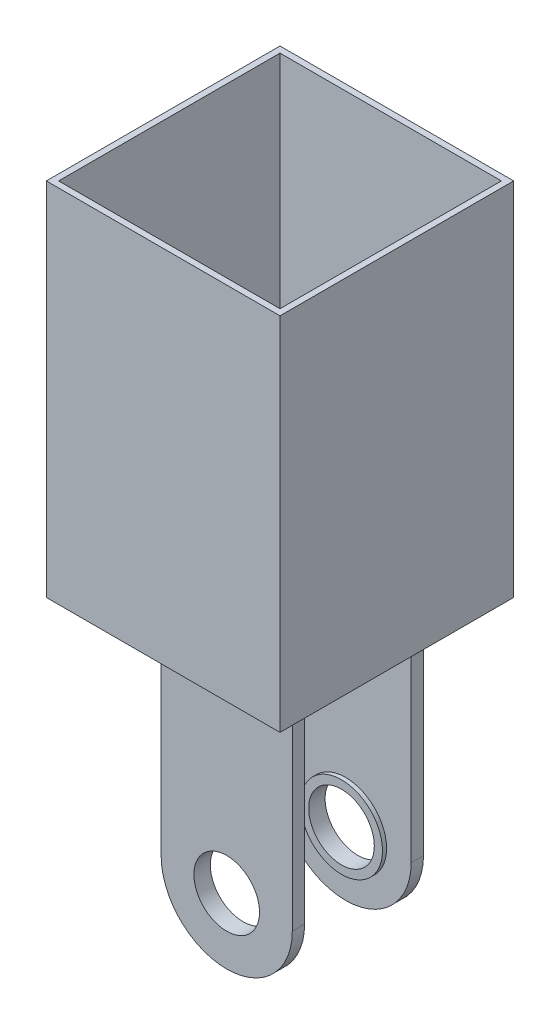
ISO-10303-21;
HEADER;
FILE_DESCRIPTION(('STEP AP214'),'2;1');
FILE_NAME('part.step','',(''),(''),'','','');
FILE_SCHEMA(('AUTOMOTIVE_DESIGN { 1 0 10303 214 1 1 1 1 }'));
ENDSEC;
DATA;
#1=APPLICATION_CONTEXT('core data for automotive mechanical design processes');
#2=APPLICATION_PROTOCOL_DEFINITION('international standard','automotive_design',2000,#1);
#3=PRODUCT_CONTEXT('',#1,'mechanical');
#4=PRODUCT('Part','Part','',(#3));
#5=PRODUCT_RELATED_PRODUCT_CATEGORY('part','',(#4));
#6=PRODUCT_DEFINITION_FORMATION('','',#4);
#7=PRODUCT_DEFINITION_CONTEXT('part definition',#1,'design');
#8=PRODUCT_DEFINITION('design','',#6,#7);
#9=PRODUCT_DEFINITION_SHAPE('','',#8);
#10=(LENGTH_UNIT() NAMED_UNIT(*) SI_UNIT(.MILLI.,.METRE.));
#11=(NAMED_UNIT(*) PLANE_ANGLE_UNIT() SI_UNIT($,.RADIAN.));
#12=(NAMED_UNIT(*) SI_UNIT($,.STERADIAN.) SOLID_ANGLE_UNIT());
#13=UNCERTAINTY_MEASURE_WITH_UNIT(LENGTH_MEASURE(1.E-05),#10,'distance_accuracy_value','');
#14=(GEOMETRIC_REPRESENTATION_CONTEXT(3) GLOBAL_UNCERTAINTY_ASSIGNED_CONTEXT((#13)) GLOBAL_UNIT_ASSIGNED_CONTEXT((#10,
#11,#12)) REPRESENTATION_CONTEXT('',''));
#15=CARTESIAN_POINT('',(0.,0.,0.));
#16=DIRECTION('',(0.,0.,1.));
#17=DIRECTION('',(1.,0.,0.));
#18=AXIS2_PLACEMENT_3D('',#15,#16,#17);
#19=CARTESIAN_POINT('',(0.,0.,3.));
#20=DIRECTION('',(0.,0.,1.));
#21=DIRECTION('',(1.,0.,0.));
#22=AXIS2_PLACEMENT_3D('',#19,#20,#21);
#23=PLANE('',#22);
#24=DIRECTION('',(1.,0.,0.));
#25=VECTOR('',#24,1.);
#26=CARTESIAN_POINT('',(0.,56.,3.));
#27=LINE('',#26,#25);
#28=CARTESIAN_POINT('',(-16.,56.,3.));
#29=VERTEX_POINT('',#28);
#30=CARTESIAN_POINT('',(16.,56.,3.));
#31=VERTEX_POINT('',#30);
#32=EDGE_CURVE('E261',#29,#31,#27,.T.);
#33=ORIENTED_EDGE('',*,*,#32,.F.);
#34=DIRECTION('',(0.,1.,0.));
#35=VECTOR('',#34,1.);
#36=CARTESIAN_POINT('',(-16.,0.,3.));
#37=LINE('',#36,#35);
#38=CARTESIAN_POINT('',(-16.,0.,3.));
#39=VERTEX_POINT('',#38);
#40=EDGE_CURVE('E282',#39,#29,#37,.T.);
#41=ORIENTED_EDGE('',*,*,#40,.F.);
#42=CARTESIAN_POINT('',(0.,0.,3.));
#43=DIRECTION('',(0.,0.,1.));
#44=DIRECTION('',(1.,0.,0.));
#45=AXIS2_PLACEMENT_3D('',#42,#43,#44);
#46=CIRCLE('',#45,16.);
#47=CARTESIAN_POINT('',(16.,0.,3.));
#48=VERTEX_POINT('',#47);
#49=EDGE_CURVE('E285',#39,#48,#46,.T.);
#50=ORIENTED_EDGE('',*,*,#49,.T.);
#51=DIRECTION('',(0.,1.,0.));
#52=VECTOR('',#51,1.);
#53=CARTESIAN_POINT('',(16.,0.,3.));
#54=LINE('',#53,#52);
#55=EDGE_CURVE('E289',#48,#31,#54,.T.);
#56=ORIENTED_EDGE('',*,*,#55,.T.);
#57=EDGE_LOOP('',(#33,#41,#50,#56));
#58=FACE_BOUND('',#57,.T.);
#59=CARTESIAN_POINT('',(0.,0.,3.));
#60=DIRECTION('',(0.,0.,1.));
#61=DIRECTION('',(1.,0.,0.));
#62=AXIS2_PLACEMENT_3D('',#59,#60,#61);
#63=CIRCLE('',#62,10.);
#64=CARTESIAN_POINT('',(10.,0.,3.));
#65=VERTEX_POINT('',#64);
#66=EDGE_CURVE('E275',#65,#65,#63,.T.);
#67=ORIENTED_EDGE('',*,*,#66,.F.);
#68=EDGE_LOOP('',(#67));
#69=FACE_BOUND('',#68,.T.);
#70=ADVANCED_FACE('F40',(#58,#69),#23,.T.);
#71=CARTESIAN_POINT('',(-16.,0.,3.));
#72=DIRECTION('',(-1.,0.,0.));
#73=DIRECTION('',(0.,0.,1.));
#74=AXIS2_PLACEMENT_3D('',#71,#72,#73);
#75=PLANE('',#74);
#76=DIRECTION('',(0.,1.,0.));
#77=VECTOR('',#76,1.);
#78=CARTESIAN_POINT('',(-16.,0.,0.));
#79=LINE('',#78,#77);
#80=CARTESIAN_POINT('',(-16.,0.,0.));
#81=VERTEX_POINT('',#80);
#82=CARTESIAN_POINT('',(-16.,56.,0.));
#83=VERTEX_POINT('',#82);
#84=EDGE_CURVE('E294',#81,#83,#79,.T.);
#85=ORIENTED_EDGE('',*,*,#84,.F.);
#86=DIRECTION('',(0.,0.,-1.));
#87=VECTOR('',#86,1.);
#88=CARTESIAN_POINT('',(-16.,0.,3.));
#89=LINE('',#88,#87);
#90=EDGE_CURVE('E48',#39,#81,#89,.T.);
#91=ORIENTED_EDGE('',*,*,#90,.F.);
#92=ORIENTED_EDGE('',*,*,#40,.T.);
#93=DIRECTION('',(0.,0.,-1.));
#94=VECTOR('',#93,1.);
#95=CARTESIAN_POINT('',(-16.,56.,3.));
#96=LINE('',#95,#94);
#97=EDGE_CURVE('E291',#29,#83,#96,.T.);
#98=ORIENTED_EDGE('',*,*,#97,.T.);
#99=EDGE_LOOP('',(#85,#91,#92,#98));
#100=FACE_BOUND('',#99,.T.);
#101=ADVANCED_FACE('F323',(#100),#75,.T.);
#102=CARTESIAN_POINT('',(0.,0.,3.));
#103=DIRECTION('',(0.,0.,-1.));
#104=DIRECTION('',(-1.,0.,0.));
#105=AXIS2_PLACEMENT_3D('',#102,#103,#104);
#106=CYLINDRICAL_SURFACE('',#105,16.);
#107=CARTESIAN_POINT('',(0.,0.,0.));
#108=DIRECTION('',(0.,0.,1.));
#109=DIRECTION('',(1.,0.,0.));
#110=AXIS2_PLACEMENT_3D('',#107,#108,#109);
#111=CIRCLE('',#110,16.);
#112=CARTESIAN_POINT('',(16.,0.,0.));
#113=VERTEX_POINT('',#112);
#114=EDGE_CURVE('E297',#81,#113,#111,.T.);
#115=ORIENTED_EDGE('',*,*,#114,.T.);
#116=DIRECTION('',(0.,0.,-1.));
#117=VECTOR('',#116,1.);
#118=CARTESIAN_POINT('',(16.,0.,3.));
#119=LINE('',#118,#117);
#120=EDGE_CURVE('E311',#48,#113,#119,.T.);
#121=ORIENTED_EDGE('',*,*,#120,.F.);
#122=ORIENTED_EDGE('',*,*,#49,.F.);
#123=ORIENTED_EDGE('',*,*,#90,.T.);
#124=EDGE_LOOP('',(#115,#121,#122,#123));
#125=FACE_BOUND('',#124,.T.);
#126=ADVANCED_FACE('F316',(#125),#106,.T.);
#127=CARTESIAN_POINT('',(16.,0.,3.));
#128=DIRECTION('',(-1.,0.,0.));
#129=DIRECTION('',(0.,0.,1.));
#130=AXIS2_PLACEMENT_3D('',#127,#128,#129);
#131=PLANE('',#130);
#132=DIRECTION('',(0.,1.,0.));
#133=VECTOR('',#132,1.);
#134=CARTESIAN_POINT('',(16.,0.,0.));
#135=LINE('',#134,#133);
#136=CARTESIAN_POINT('',(16.,56.,0.));
#137=VERTEX_POINT('',#136);
#138=EDGE_CURVE('E286',#113,#137,#135,.T.);
#139=ORIENTED_EDGE('',*,*,#138,.T.);
#140=DIRECTION('',(0.,0.,-1.));
#141=VECTOR('',#140,1.);
#142=CARTESIAN_POINT('',(16.,56.,3.));
#143=LINE('',#142,#141);
#144=EDGE_CURVE('E308',#31,#137,#143,.T.);
#145=ORIENTED_EDGE('',*,*,#144,.F.);
#146=ORIENTED_EDGE('',*,*,#55,.F.);
#147=ORIENTED_EDGE('',*,*,#120,.T.);
#148=EDGE_LOOP('',(#139,#145,#146,#147));
#149=FACE_BOUND('',#148,.T.);
#150=ADVANCED_FACE('F329',(#149),#131,.F.);
#151=CARTESIAN_POINT('',(28.5,0.,3.));
#152=DIRECTION('',(-1.,0.,0.));
#153=DIRECTION('',(0.,-1.,0.));
#154=AXIS2_PLACEMENT_3D('',#151,#152,#153);
#155=PLANE('',#154);
#156=DIRECTION('',(0.,-1.,0.));
#157=VECTOR('',#156,1.);
#158=CARTESIAN_POINT('',(28.5,59.,-9.5));
#159=LINE('',#158,#157);
#160=CARTESIAN_POINT('',(28.4999999999999,144.,-9.5));
#161=VERTEX_POINT('',#160);
#162=CARTESIAN_POINT('',(28.5,56.,-9.5));
#163=VERTEX_POINT('',#162);
#164=EDGE_CURVE('E258',#161,#163,#159,.T.);
#165=ORIENTED_EDGE('',*,*,#164,.F.);
#166=DIRECTION('',(0.,0.,-1.));
#167=VECTOR('',#166,1.);
#168=CARTESIAN_POINT('',(28.4999999999999,144.,-9.5));
#169=LINE('',#168,#167);
#170=CARTESIAN_POINT('',(28.4999999999999,144.,47.5));
#171=VERTEX_POINT('',#170);
#172=EDGE_CURVE('E198',#171,#161,#169,.T.);
#173=ORIENTED_EDGE('',*,*,#172,.F.);
#174=DIRECTION('',(0.,-1.,0.));
#175=VECTOR('',#174,1.);
#176=CARTESIAN_POINT('',(28.5,59.,47.5));
#177=LINE('',#176,#175);
#178=CARTESIAN_POINT('',(28.5,56.,47.5));
#179=VERTEX_POINT('',#178);
#180=EDGE_CURVE('E257',#171,#179,#177,.T.);
#181=ORIENTED_EDGE('',*,*,#180,.T.);
#182=DIRECTION('',(0.,0.,-1.));
#183=VECTOR('',#182,1.);
#184=CARTESIAN_POINT('',(28.5,56.,3.));
#185=LINE('',#184,#183);
#186=EDGE_CURVE('E306',#179,#163,#185,.T.);
#187=ORIENTED_EDGE('',*,*,#186,.T.);
#188=EDGE_LOOP('',(#165,#173,#181,#187));
#189=FACE_BOUND('',#188,.T.);
#190=ADVANCED_FACE('F363',(#189),#155,.F.);
#191=CARTESIAN_POINT('',(-28.5,0.,3.));
#192=DIRECTION('',(-1.,0.,0.));
#193=DIRECTION('',(0.,-1.,0.));
#194=AXIS2_PLACEMENT_3D('',#191,#192,#193);
#195=PLANE('',#194);
#196=DIRECTION('',(0.,-1.,0.));
#197=VECTOR('',#196,1.);
#198=CARTESIAN_POINT('',(-28.5,59.,47.5));
#199=LINE('',#198,#197);
#200=CARTESIAN_POINT('',(-28.5000000000001,144.,47.5));
#201=VERTEX_POINT('',#200);
#202=CARTESIAN_POINT('',(-28.5,56.,47.5));
#203=VERTEX_POINT('',#202);
#204=EDGE_CURVE('E265',#201,#203,#199,.T.);
#205=ORIENTED_EDGE('',*,*,#204,.F.);
#206=DIRECTION('',(0.,0.,1.));
#207=VECTOR('',#206,1.);
#208=CARTESIAN_POINT('',(-28.5000000000001,144.,-9.5));
#209=LINE('',#208,#207);
#210=CARTESIAN_POINT('',(-28.5000000000001,144.,-9.5));
#211=VERTEX_POINT('',#210);
#212=EDGE_CURVE('E169',#211,#201,#209,.T.);
#213=ORIENTED_EDGE('',*,*,#212,.F.);
#214=DIRECTION('',(0.,-1.,0.));
#215=VECTOR('',#214,1.);
#216=CARTESIAN_POINT('',(-28.5,59.,-9.5));
#217=LINE('',#216,#215);
#218=CARTESIAN_POINT('',(-28.5,56.,-9.5));
#219=VERTEX_POINT('',#218);
#220=EDGE_CURVE('E262',#211,#219,#217,.T.);
#221=ORIENTED_EDGE('',*,*,#220,.T.);
#222=DIRECTION('',(0.,0.,-1.));
#223=VECTOR('',#222,1.);
#224=CARTESIAN_POINT('',(-28.5,56.,3.));
#225=LINE('',#224,#223);
#226=EDGE_CURVE('E304',#203,#219,#225,.T.);
#227=ORIENTED_EDGE('',*,*,#226,.F.);
#228=EDGE_LOOP('',(#205,#213,#221,#227));
#229=FACE_BOUND('',#228,.T.);
#230=ADVANCED_FACE('F360',(#229),#195,.T.);
#231=CARTESIAN_POINT('',(0.,0.,3.));
#232=DIRECTION('',(0.,0.,-1.));
#233=DIRECTION('',(-1.,0.,0.));
#234=AXIS2_PLACEMENT_3D('',#231,#232,#233);
#235=CYLINDRICAL_SURFACE('',#234,8.);
#236=CARTESIAN_POINT('',(0.,0.,0.));
#237=DIRECTION('',(0.,0.,1.));
#238=DIRECTION('',(1.,0.,0.));
#239=AXIS2_PLACEMENT_3D('',#236,#237,#238);
#240=CIRCLE('',#239,8.);
#241=CARTESIAN_POINT('',(8.,0.,0.));
#242=VERTEX_POINT('',#241);
#243=EDGE_CURVE('E279',#242,#242,#240,.T.);
#244=ORIENTED_EDGE('',*,*,#243,.F.);
#245=EDGE_LOOP('',(#244));
#246=FACE_BOUND('',#245,.T.);
#247=CARTESIAN_POINT('',(0.,0.,4.));
#248=DIRECTION('',(0.,0.,1.));
#249=DIRECTION('',(1.,0.,0.));
#250=AXIS2_PLACEMENT_3D('',#247,#248,#249);
#251=CIRCLE('',#250,8.);
#252=CARTESIAN_POINT('',(8.,0.,4.));
#253=VERTEX_POINT('',#252);
#254=EDGE_CURVE('E272',#253,#253,#251,.T.);
#255=ORIENTED_EDGE('',*,*,#254,.T.);
#256=EDGE_LOOP('',(#255));
#257=FACE_BOUND('',#256,.T.);
#258=ADVANCED_FACE('F42',(#246,#257),#235,.F.);
#259=CARTESIAN_POINT('',(0.,56.,3.));
#260=DIRECTION('',(0.,-1.,0.));
#261=DIRECTION('',(1.,0.,0.));
#262=AXIS2_PLACEMENT_3D('',#259,#260,#261);
#263=PLANE('',#262);
#264=CARTESIAN_POINT('',(0.,56.,19.));
#265=DIRECTION('',(0.,-1.,0.));
#266=DIRECTION('',(1.,0.,0.));
#267=AXIS2_PLACEMENT_3D('',#264,#265,#266);
#268=CIRCLE('',#267,7.25);
#269=CARTESIAN_POINT('',(7.24999999999998,56.,19.));
#270=VERTEX_POINT('',#269);
#271=EDGE_CURVE('E207',#270,#270,#268,.T.);
#272=ORIENTED_EDGE('',*,*,#271,.F.);
#273=EDGE_LOOP('',(#272));
#274=FACE_BOUND('',#273,.T.);
#275=DIRECTION('',(0.,0.,-1.));
#276=VECTOR('',#275,1.);
#277=CARTESIAN_POINT('',(16.,56.,32.));
#278=LINE('',#277,#276);
#279=CARTESIAN_POINT('',(16.,56.,32.));
#280=VERTEX_POINT('',#279);
#281=CARTESIAN_POINT('',(16.,56.,29.));
#282=VERTEX_POINT('',#281);
#283=EDGE_CURVE('E238',#280,#282,#278,.T.);
#284=ORIENTED_EDGE('',*,*,#283,.T.);
#285=DIRECTION('',(-1.,0.,0.));
#286=VECTOR('',#285,1.);
#287=CARTESIAN_POINT('',(0.,56.,29.));
#288=LINE('',#287,#286);
#289=CARTESIAN_POINT('',(-16.,56.,29.));
#290=VERTEX_POINT('',#289);
#291=EDGE_CURVE('E63',#282,#290,#288,.T.);
#292=ORIENTED_EDGE('',*,*,#291,.T.);
#293=DIRECTION('',(0.,0.,-1.));
#294=VECTOR('',#293,1.);
#295=CARTESIAN_POINT('',(-16.,56.,32.));
#296=LINE('',#295,#294);
#297=CARTESIAN_POINT('',(-16.,56.,32.));
#298=VERTEX_POINT('',#297);
#299=EDGE_CURVE('E229',#298,#290,#296,.T.);
#300=ORIENTED_EDGE('',*,*,#299,.F.);
#301=DIRECTION('',(-1.,0.,0.));
#302=VECTOR('',#301,1.);
#303=CARTESIAN_POINT('',(0.,56.,32.));
#304=LINE('',#303,#302);
#305=EDGE_CURVE('E247',#280,#298,#304,.T.);
#306=ORIENTED_EDGE('',*,*,#305,.F.);
#307=EDGE_LOOP('',(#284,#292,#300,#306));
#308=FACE_BOUND('',#307,.T.);
#309=DIRECTION('',(1.,0.,0.));
#310=VECTOR('',#309,1.);
#311=CARTESIAN_POINT('',(-28.5,56.,-9.5));
#312=LINE('',#311,#310);
#313=EDGE_CURVE('E254',#219,#163,#312,.T.);
#314=ORIENTED_EDGE('',*,*,#313,.T.);
#315=ORIENTED_EDGE('',*,*,#186,.F.);
#316=DIRECTION('',(-1.,0.,0.));
#317=VECTOR('',#316,1.);
#318=CARTESIAN_POINT('',(-28.5,56.,47.5));
#319=LINE('',#318,#317);
#320=EDGE_CURVE('E251',#179,#203,#319,.T.);
#321=ORIENTED_EDGE('',*,*,#320,.T.);
#322=ORIENTED_EDGE('',*,*,#226,.T.);
#323=EDGE_LOOP('',(#314,#315,#321,#322));
#324=FACE_BOUND('',#323,.T.);
#325=ORIENTED_EDGE('',*,*,#97,.F.);
#326=ORIENTED_EDGE('',*,*,#32,.T.);
#327=ORIENTED_EDGE('',*,*,#144,.T.);
#328=DIRECTION('',(1.,0.,0.));
#329=VECTOR('',#328,1.);
#330=CARTESIAN_POINT('',(0.,56.,0.));
#331=LINE('',#330,#329);
#332=EDGE_CURVE('E11',#83,#137,#331,.T.);
#333=ORIENTED_EDGE('',*,*,#332,.F.);
#334=EDGE_LOOP('',(#325,#326,#327,#333));
#335=FACE_BOUND('',#334,.T.);
#336=ADVANCED_FACE('F326',(#274,#308,#324,#335),#263,.T.);
#337=CARTESIAN_POINT('',(0.,0.,0.));
#338=DIRECTION('',(0.,0.,1.));
#339=DIRECTION('',(1.,0.,0.));
#340=AXIS2_PLACEMENT_3D('',#337,#338,#339);
#341=PLANE('',#340);
#342=ORIENTED_EDGE('',*,*,#243,.T.);
#343=EDGE_LOOP('',(#342));
#344=FACE_BOUND('',#343,.T.);
#345=ORIENTED_EDGE('',*,*,#84,.T.);
#346=ORIENTED_EDGE('',*,*,#332,.T.);
#347=ORIENTED_EDGE('',*,*,#138,.F.);
#348=ORIENTED_EDGE('',*,*,#114,.F.);
#349=EDGE_LOOP('',(#345,#346,#347,#348));
#350=FACE_BOUND('',#349,.T.);
#351=ADVANCED_FACE('F322',(#344,#350),#341,.F.);
#352=CARTESIAN_POINT('',(0.,0.,4.));
#353=DIRECTION('',(0.,0.,1.));
#354=DIRECTION('',(1.,0.,0.));
#355=AXIS2_PLACEMENT_3D('',#352,#353,#354);
#356=PLANE('',#355);
#357=CARTESIAN_POINT('',(0.,0.,4.));
#358=DIRECTION('',(0.,0.,1.));
#359=DIRECTION('',(1.,0.,0.));
#360=AXIS2_PLACEMENT_3D('',#357,#358,#359);
#361=CIRCLE('',#360,10.);
#362=CARTESIAN_POINT('',(10.,0.,4.));
#363=VERTEX_POINT('',#362);
#364=EDGE_CURVE('E276',#363,#363,#361,.T.);
#365=ORIENTED_EDGE('',*,*,#364,.T.);
#366=EDGE_LOOP('',(#365));
#367=FACE_BOUND('',#366,.T.);
#368=ORIENTED_EDGE('',*,*,#254,.F.);
#369=EDGE_LOOP('',(#368));
#370=FACE_BOUND('',#369,.T.);
#371=ADVANCED_FACE('F339',(#367,#370),#356,.T.);
#372=CARTESIAN_POINT('',(0.,0.,4.));
#373=DIRECTION('',(0.,0.,-1.));
#374=DIRECTION('',(-1.,0.,0.));
#375=AXIS2_PLACEMENT_3D('',#372,#373,#374);
#376=CYLINDRICAL_SURFACE('',#375,10.);
#377=ORIENTED_EDGE('',*,*,#364,.F.);
#378=EDGE_LOOP('',(#377));
#379=FACE_BOUND('',#378,.T.);
#380=ORIENTED_EDGE('',*,*,#66,.T.);
#381=EDGE_LOOP('',(#380));
#382=FACE_BOUND('',#381,.T.);
#383=ADVANCED_FACE('F336',(#379,#382),#376,.T.);
#384=CARTESIAN_POINT('',(-28.5,59.,-9.5));
#385=DIRECTION('',(0.,0.,-1.));
#386=DIRECTION('',(-1.,0.,0.));
#387=AXIS2_PLACEMENT_3D('',#384,#385,#386);
#388=PLANE('',#387);
#389=ORIENTED_EDGE('',*,*,#313,.F.);
#390=ORIENTED_EDGE('',*,*,#220,.F.);
#391=DIRECTION('',(-1.,0.,0.));
#392=VECTOR('',#391,1.);
#393=CARTESIAN_POINT('',(-28.5000000000001,144.,-9.5));
#394=LINE('',#393,#392);
#395=EDGE_CURVE('E201',#161,#211,#394,.T.);
#396=ORIENTED_EDGE('',*,*,#395,.F.);
#397=ORIENTED_EDGE('',*,*,#164,.T.);
#398=EDGE_LOOP('',(#389,#390,#396,#397));
#399=FACE_BOUND('',#398,.T.);
#400=ADVANCED_FACE('F338',(#399),#388,.T.);
#401=CARTESIAN_POINT('',(0.,59.,0.));
#402=DIRECTION('',(0.,-1.,0.));
#403=DIRECTION('',(1.,0.,0.));
#404=AXIS2_PLACEMENT_3D('',#401,#402,#403);
#405=PLANE('',#404);
#406=DIRECTION('',(1.,0.,0.));
#407=VECTOR('',#406,1.);
#408=CARTESIAN_POINT('',(-27.,59.,46.));
#409=LINE('',#408,#407);
#410=CARTESIAN_POINT('',(-27.,59.,46.));
#411=VERTEX_POINT('',#410);
#412=CARTESIAN_POINT('',(27.,59.,46.));
#413=VERTEX_POINT('',#412);
#414=EDGE_CURVE('E162',#411,#413,#409,.T.);
#415=ORIENTED_EDGE('',*,*,#414,.T.);
#416=DIRECTION('',(0.,0.,-1.));
#417=VECTOR('',#416,1.);
#418=CARTESIAN_POINT('',(27.,59.,-8.00000000000001));
#419=LINE('',#418,#417);
#420=CARTESIAN_POINT('',(27.,59.,-8.00000000000001));
#421=VERTEX_POINT('',#420);
#422=EDGE_CURVE('E181',#413,#421,#419,.T.);
#423=ORIENTED_EDGE('',*,*,#422,.T.);
#424=DIRECTION('',(-1.,0.,0.));
#425=VECTOR('',#424,1.);
#426=CARTESIAN_POINT('',(-27.,59.,-8.00000000000001));
#427=LINE('',#426,#425);
#428=CARTESIAN_POINT('',(-27.,59.,-8.00000000000001));
#429=VERTEX_POINT('',#428);
#430=EDGE_CURVE('E168',#421,#429,#427,.T.);
#431=ORIENTED_EDGE('',*,*,#430,.T.);
#432=DIRECTION('',(0.,0.,1.));
#433=VECTOR('',#432,1.);
#434=CARTESIAN_POINT('',(-27.,59.,-8.00000000000001));
#435=LINE('',#434,#433);
#436=EDGE_CURVE('E184',#429,#411,#435,.T.);
#437=ORIENTED_EDGE('',*,*,#436,.T.);
#438=EDGE_LOOP('',(#415,#423,#431,#437));
#439=FACE_BOUND('',#438,.T.);
#440=CARTESIAN_POINT('',(0.,59.,19.));
#441=DIRECTION('',(0.,-1.,0.));
#442=DIRECTION('',(1.,0.,0.));
#443=AXIS2_PLACEMENT_3D('',#440,#441,#442);
#444=CIRCLE('',#443,7.25);
#445=CARTESIAN_POINT('',(7.24999999999997,59.,19.));
#446=VERTEX_POINT('',#445);
#447=EDGE_CURVE('E204',#446,#446,#444,.F.);
#448=ORIENTED_EDGE('',*,*,#447,.F.);
#449=EDGE_LOOP('',(#448));
#450=FACE_BOUND('',#449,.T.);
#451=ADVANCED_FACE('F346',(#439,#450),#405,.F.);
#452=CARTESIAN_POINT('',(-28.5,59.,47.5));
#453=DIRECTION('',(0.,0.,1.));
#454=DIRECTION('',(1.,0.,0.));
#455=AXIS2_PLACEMENT_3D('',#452,#453,#454);
#456=PLANE('',#455);
#457=ORIENTED_EDGE('',*,*,#320,.F.);
#458=ORIENTED_EDGE('',*,*,#180,.F.);
#459=DIRECTION('',(1.,0.,0.));
#460=VECTOR('',#459,1.);
#461=CARTESIAN_POINT('',(-28.5000000000001,144.,47.5));
#462=LINE('',#461,#460);
#463=EDGE_CURVE('E195',#201,#171,#462,.T.);
#464=ORIENTED_EDGE('',*,*,#463,.F.);
#465=ORIENTED_EDGE('',*,*,#204,.T.);
#466=EDGE_LOOP('',(#457,#458,#464,#465));
#467=FACE_BOUND('',#466,.T.);
#468=ADVANCED_FACE('F443',(#467),#456,.T.);
#469=CARTESIAN_POINT('',(0.,0.,29.));
#470=DIRECTION('',(0.,0.,1.));
#471=DIRECTION('',(1.,0.,0.));
#472=AXIS2_PLACEMENT_3D('',#469,#470,#471);
#473=PLANE('',#472);
#474=ORIENTED_EDGE('',*,*,#291,.F.);
#475=DIRECTION('',(0.,-1.,0.));
#476=VECTOR('',#475,1.);
#477=CARTESIAN_POINT('',(16.,0.,29.));
#478=LINE('',#477,#476);
#479=CARTESIAN_POINT('',(16.,0.,29.));
#480=VERTEX_POINT('',#479);
#481=EDGE_CURVE('E221',#282,#480,#478,.T.);
#482=ORIENTED_EDGE('',*,*,#481,.T.);
#483=CARTESIAN_POINT('',(0.,0.,29.));
#484=DIRECTION('',(0.,0.,1.));
#485=DIRECTION('',(1.,0.,0.));
#486=AXIS2_PLACEMENT_3D('',#483,#484,#485);
#487=CIRCLE('',#486,16.);
#488=CARTESIAN_POINT('',(-16.,0.,29.));
#489=VERTEX_POINT('',#488);
#490=EDGE_CURVE('E232',#489,#480,#487,.T.);
#491=ORIENTED_EDGE('',*,*,#490,.F.);
#492=DIRECTION('',(0.,1.,0.));
#493=VECTOR('',#492,1.);
#494=CARTESIAN_POINT('',(-16.,0.,29.));
#495=LINE('',#494,#493);
#496=EDGE_CURVE('E216',#489,#290,#495,.T.);
#497=ORIENTED_EDGE('',*,*,#496,.T.);
#498=EDGE_LOOP('',(#474,#482,#491,#497));
#499=FACE_BOUND('',#498,.T.);
#500=CARTESIAN_POINT('',(0.,0.,29.));
#501=DIRECTION('',(0.,0.,1.));
#502=DIRECTION('',(1.,0.,0.));
#503=AXIS2_PLACEMENT_3D('',#500,#501,#502);
#504=CIRCLE('',#503,10.);
#505=CARTESIAN_POINT('',(10.,0.,29.));
#506=VERTEX_POINT('',#505);
#507=EDGE_CURVE('E244',#506,#506,#504,.F.);
#508=ORIENTED_EDGE('',*,*,#507,.F.);
#509=EDGE_LOOP('',(#508));
#510=FACE_BOUND('',#509,.T.);
#511=ADVANCED_FACE('F437',(#499,#510),#473,.F.);
#512=CARTESIAN_POINT('',(-16.,0.,32.));
#513=DIRECTION('',(-1.,0.,0.));
#514=DIRECTION('',(0.,0.,1.));
#515=AXIS2_PLACEMENT_3D('',#512,#513,#514);
#516=PLANE('',#515);
#517=ORIENTED_EDGE('',*,*,#496,.F.);
#518=DIRECTION('',(0.,0.,-1.));
#519=VECTOR('',#518,1.);
#520=CARTESIAN_POINT('',(-16.,0.,32.));
#521=LINE('',#520,#519);
#522=CARTESIAN_POINT('',(-16.,0.,32.));
#523=VERTEX_POINT('',#522);
#524=EDGE_CURVE('E242',#523,#489,#521,.T.);
#525=ORIENTED_EDGE('',*,*,#524,.F.);
#526=DIRECTION('',(0.,1.,0.));
#527=VECTOR('',#526,1.);
#528=CARTESIAN_POINT('',(-16.,0.,32.));
#529=LINE('',#528,#527);
#530=EDGE_CURVE('E220',#523,#298,#529,.T.);
#531=ORIENTED_EDGE('',*,*,#530,.T.);
#532=ORIENTED_EDGE('',*,*,#299,.T.);
#533=EDGE_LOOP('',(#517,#525,#531,#532));
#534=FACE_BOUND('',#533,.T.);
#535=ADVANCED_FACE('F442',(#534),#516,.T.);
#536=CARTESIAN_POINT('',(0.,0.,32.));
#537=DIRECTION('',(0.,0.,-1.));
#538=DIRECTION('',(-1.,0.,0.));
#539=AXIS2_PLACEMENT_3D('',#536,#537,#538);
#540=CYLINDRICAL_SURFACE('',#539,16.);
#541=ORIENTED_EDGE('',*,*,#490,.T.);
#542=DIRECTION('',(0.,0.,-1.));
#543=VECTOR('',#542,1.);
#544=CARTESIAN_POINT('',(16.,0.,32.));
#545=LINE('',#544,#543);
#546=CARTESIAN_POINT('',(16.,0.,32.));
#547=VERTEX_POINT('',#546);
#548=EDGE_CURVE('E240',#547,#480,#545,.T.);
#549=ORIENTED_EDGE('',*,*,#548,.F.);
#550=CARTESIAN_POINT('',(0.,0.,32.));
#551=DIRECTION('',(0.,0.,1.));
#552=DIRECTION('',(1.,0.,0.));
#553=AXIS2_PLACEMENT_3D('',#550,#551,#552);
#554=CIRCLE('',#553,16.);
#555=EDGE_CURVE('E224',#523,#547,#554,.T.);
#556=ORIENTED_EDGE('',*,*,#555,.F.);
#557=ORIENTED_EDGE('',*,*,#524,.T.);
#558=EDGE_LOOP('',(#541,#549,#556,#557));
#559=FACE_BOUND('',#558,.T.);
#560=ADVANCED_FACE('F453',(#559),#540,.T.);
#561=CARTESIAN_POINT('',(16.,0.,32.));
#562=DIRECTION('',(1.,0.,0.));
#563=DIRECTION('',(0.,0.,-1.));
#564=AXIS2_PLACEMENT_3D('',#561,#562,#563);
#565=PLANE('',#564);
#566=ORIENTED_EDGE('',*,*,#481,.F.);
#567=ORIENTED_EDGE('',*,*,#283,.F.);
#568=DIRECTION('',(0.,-1.,0.));
#569=VECTOR('',#568,1.);
#570=CARTESIAN_POINT('',(16.,0.,32.));
#571=LINE('',#570,#569);
#572=EDGE_CURVE('E226',#280,#547,#571,.T.);
#573=ORIENTED_EDGE('',*,*,#572,.T.);
#574=ORIENTED_EDGE('',*,*,#548,.T.);
#575=EDGE_LOOP('',(#566,#567,#573,#574));
#576=FACE_BOUND('',#575,.T.);
#577=ADVANCED_FACE('F465',(#576),#565,.T.);
#578=CARTESIAN_POINT('',(0.,0.,32.));
#579=DIRECTION('',(0.,0.,-1.));
#580=DIRECTION('',(-1.,0.,0.));
#581=AXIS2_PLACEMENT_3D('',#578,#579,#580);
#582=CYLINDRICAL_SURFACE('',#581,8.);
#583=CARTESIAN_POINT('',(0.,0.,32.));
#584=DIRECTION('',(0.,0.,1.));
#585=DIRECTION('',(1.,0.,0.));
#586=AXIS2_PLACEMENT_3D('',#583,#584,#585);
#587=CIRCLE('',#586,8.);
#588=CARTESIAN_POINT('',(8.,0.,32.));
#589=VERTEX_POINT('',#588);
#590=EDGE_CURVE('E217',#589,#589,#587,.T.);
#591=ORIENTED_EDGE('',*,*,#590,.T.);
#592=EDGE_LOOP('',(#591));
#593=FACE_BOUND('',#592,.T.);
#594=CARTESIAN_POINT('',(0.,0.,28.));
#595=DIRECTION('',(0.,0.,-1.));
#596=DIRECTION('',(-1.,0.,0.));
#597=AXIS2_PLACEMENT_3D('',#594,#595,#596);
#598=CIRCLE('',#597,8.);
#599=CARTESIAN_POINT('',(-8.,0.,28.));
#600=VERTEX_POINT('',#599);
#601=EDGE_CURVE('E210',#600,#600,#598,.T.);
#602=ORIENTED_EDGE('',*,*,#601,.T.);
#603=EDGE_LOOP('',(#602));
#604=FACE_BOUND('',#603,.T.);
#605=ADVANCED_FACE('F477',(#593,#604),#582,.F.);
#606=CARTESIAN_POINT('',(0.,0.,32.));
#607=DIRECTION('',(0.,0.,1.));
#608=DIRECTION('',(1.,0.,0.));
#609=AXIS2_PLACEMENT_3D('',#606,#607,#608);
#610=PLANE('',#609);
#611=ORIENTED_EDGE('',*,*,#590,.F.);
#612=EDGE_LOOP('',(#611));
#613=FACE_BOUND('',#612,.T.);
#614=ORIENTED_EDGE('',*,*,#572,.F.);
#615=ORIENTED_EDGE('',*,*,#305,.T.);
#616=ORIENTED_EDGE('',*,*,#530,.F.);
#617=ORIENTED_EDGE('',*,*,#555,.T.);
#618=EDGE_LOOP('',(#614,#615,#616,#617));
#619=FACE_BOUND('',#618,.T.);
#620=ADVANCED_FACE('F489',(#613,#619),#610,.T.);
#621=CARTESIAN_POINT('',(0.,0.,28.));
#622=DIRECTION('',(0.,0.,-1.));
#623=DIRECTION('',(-1.,0.,0.));
#624=AXIS2_PLACEMENT_3D('',#621,#622,#623);
#625=PLANE('',#624);
#626=CARTESIAN_POINT('',(0.,0.,28.));
#627=DIRECTION('',(0.,0.,-1.));
#628=DIRECTION('',(-1.,0.,0.));
#629=AXIS2_PLACEMENT_3D('',#626,#627,#628);
#630=CIRCLE('',#629,10.);
#631=CARTESIAN_POINT('',(-10.,0.,28.));
#632=VERTEX_POINT('',#631);
#633=EDGE_CURVE('E213',#632,#632,#630,.T.);
#634=ORIENTED_EDGE('',*,*,#633,.T.);
#635=EDGE_LOOP('',(#634));
#636=FACE_BOUND('',#635,.T.);
#637=ORIENTED_EDGE('',*,*,#601,.F.);
#638=EDGE_LOOP('',(#637));
#639=FACE_BOUND('',#638,.T.);
#640=ADVANCED_FACE('F501',(#636,#639),#625,.T.);
#641=CARTESIAN_POINT('',(0.,0.,28.));
#642=DIRECTION('',(0.,0.,1.));
#643=DIRECTION('',(1.,0.,0.));
#644=AXIS2_PLACEMENT_3D('',#641,#642,#643);
#645=CYLINDRICAL_SURFACE('',#644,10.);
#646=ORIENTED_EDGE('',*,*,#633,.F.);
#647=EDGE_LOOP('',(#646));
#648=FACE_BOUND('',#647,.T.);
#649=ORIENTED_EDGE('',*,*,#507,.T.);
#650=EDGE_LOOP('',(#649));
#651=FACE_BOUND('',#650,.T.);
#652=ADVANCED_FACE('F512',(#648,#651),#645,.T.);
#653=CARTESIAN_POINT('',(0.,61.,19.));
#654=DIRECTION('',(0.,-1.,0.));
#655=DIRECTION('',(1.,0.,0.));
#656=AXIS2_PLACEMENT_3D('',#653,#654,#655);
#657=CYLINDRICAL_SURFACE('',#656,7.25);
#658=ORIENTED_EDGE('',*,*,#447,.T.);
#659=EDGE_LOOP('',(#658));
#660=FACE_BOUND('',#659,.T.);
#661=ORIENTED_EDGE('',*,*,#271,.T.);
#662=EDGE_LOOP('',(#661));
#663=FACE_BOUND('',#662,.T.);
#664=ADVANCED_FACE('F522',(#660,#663),#657,.F.);
#665=CARTESIAN_POINT('',(0.,144.,0.));
#666=DIRECTION('',(0.,1.,0.));
#667=DIRECTION('',(-1.,0.,0.));
#668=AXIS2_PLACEMENT_3D('',#665,#666,#667);
#669=PLANE('',#668);
#670=ORIENTED_EDGE('',*,*,#212,.T.);
#671=ORIENTED_EDGE('',*,*,#463,.T.);
#672=ORIENTED_EDGE('',*,*,#172,.T.);
#673=ORIENTED_EDGE('',*,*,#395,.T.);
#674=EDGE_LOOP('',(#670,#671,#672,#673));
#675=FACE_BOUND('',#674,.T.);
#676=DIRECTION('',(-1.,0.,0.));
#677=VECTOR('',#676,1.);
#678=CARTESIAN_POINT('',(-27.0000000000001,144.,-8.00000000000001));
#679=LINE('',#678,#677);
#680=CARTESIAN_POINT('',(26.9999999999999,144.,-8.00000000000001));
#681=VERTEX_POINT('',#680);
#682=CARTESIAN_POINT('',(-27.0000000000001,144.,-8.00000000000001));
#683=VERTEX_POINT('',#682);
#684=EDGE_CURVE('E161',#681,#683,#679,.T.);
#685=ORIENTED_EDGE('',*,*,#684,.F.);
#686=DIRECTION('',(0.,0.,-1.));
#687=VECTOR('',#686,1.);
#688=CARTESIAN_POINT('',(26.9999999999999,144.,-8.00000000000001));
#689=LINE('',#688,#687);
#690=CARTESIAN_POINT('',(26.9999999999999,144.,46.));
#691=VERTEX_POINT('',#690);
#692=EDGE_CURVE('E153',#691,#681,#689,.T.);
#693=ORIENTED_EDGE('',*,*,#692,.F.);
#694=DIRECTION('',(1.,0.,0.));
#695=VECTOR('',#694,1.);
#696=CARTESIAN_POINT('',(-27.0000000000001,144.,46.));
#697=LINE('',#696,#695);
#698=CARTESIAN_POINT('',(-27.0000000000001,144.,46.));
#699=VERTEX_POINT('',#698);
#700=EDGE_CURVE('E177',#699,#691,#697,.T.);
#701=ORIENTED_EDGE('',*,*,#700,.F.);
#702=DIRECTION('',(0.,0.,1.));
#703=VECTOR('',#702,1.);
#704=CARTESIAN_POINT('',(-27.0000000000001,144.,-8.00000000000001));
#705=LINE('',#704,#703);
#706=EDGE_CURVE('E175',#683,#699,#705,.T.);
#707=ORIENTED_EDGE('',*,*,#706,.F.);
#708=EDGE_LOOP('',(#685,#693,#701,#707));
#709=FACE_BOUND('',#708,.T.);
#710=ADVANCED_FACE('F173',(#675,#709),#669,.T.);
#711=CARTESIAN_POINT('',(26.9999999999999,144.,-8.00000000000001));
#712=DIRECTION('',(-1.,0.,0.));
#713=DIRECTION('',(0.,-1.,0.));
#714=AXIS2_PLACEMENT_3D('',#711,#712,#713);
#715=PLANE('',#714);
#716=ORIENTED_EDGE('',*,*,#422,.F.);
#717=DIRECTION('',(0.,-1.,0.));
#718=VECTOR('',#717,1.);
#719=CARTESIAN_POINT('',(26.9999999999999,144.,46.));
#720=LINE('',#719,#718);
#721=EDGE_CURVE('E55',#691,#413,#720,.T.);
#722=ORIENTED_EDGE('',*,*,#721,.F.);
#723=ORIENTED_EDGE('',*,*,#692,.T.);
#724=DIRECTION('',(0.,-1.,0.));
#725=VECTOR('',#724,1.);
#726=CARTESIAN_POINT('',(26.9999999999999,144.,-8.00000000000001));
#727=LINE('',#726,#725);
#728=EDGE_CURVE('E156',#681,#421,#727,.T.);
#729=ORIENTED_EDGE('',*,*,#728,.T.);
#730=EDGE_LOOP('',(#716,#722,#723,#729));
#731=FACE_BOUND('',#730,.T.);
#732=ADVANCED_FACE('F155',(#731),#715,.T.);
#733=CARTESIAN_POINT('',(-27.0000000000001,144.,-8.00000000000001));
#734=DIRECTION('',(0.,0.,1.));
#735=DIRECTION('',(0.,-1.,0.));
#736=AXIS2_PLACEMENT_3D('',#733,#734,#735);
#737=PLANE('',#736);
#738=ORIENTED_EDGE('',*,*,#430,.F.);
#739=ORIENTED_EDGE('',*,*,#728,.F.);
#740=ORIENTED_EDGE('',*,*,#684,.T.);
#741=DIRECTION('',(0.,-1.,0.));
#742=VECTOR('',#741,1.);
#743=CARTESIAN_POINT('',(-27.0000000000001,144.,-8.00000000000001));
#744=LINE('',#743,#742);
#745=EDGE_CURVE('E170',#683,#429,#744,.T.);
#746=ORIENTED_EDGE('',*,*,#745,.T.);
#747=EDGE_LOOP('',(#738,#739,#740,#746));
#748=FACE_BOUND('',#747,.T.);
#749=ADVANCED_FACE('F165',(#748),#737,.T.);
#750=CARTESIAN_POINT('',(-27.0000000000001,144.,-8.00000000000001));
#751=DIRECTION('',(1.,0.,0.));
#752=DIRECTION('',(0.,1.,0.));
#753=AXIS2_PLACEMENT_3D('',#750,#751,#752);
#754=PLANE('',#753);
#755=ORIENTED_EDGE('',*,*,#436,.F.);
#756=ORIENTED_EDGE('',*,*,#745,.F.);
#757=ORIENTED_EDGE('',*,*,#706,.T.);
#758=DIRECTION('',(0.,-1.,0.));
#759=VECTOR('',#758,1.);
#760=CARTESIAN_POINT('',(-27.0000000000001,144.,46.));
#761=LINE('',#760,#759);
#762=EDGE_CURVE('E190',#699,#411,#761,.T.);
#763=ORIENTED_EDGE('',*,*,#762,.T.);
#764=EDGE_LOOP('',(#755,#756,#757,#763));
#765=FACE_BOUND('',#764,.T.);
#766=ADVANCED_FACE('F582',(#765),#754,.T.);
#767=CARTESIAN_POINT('',(-27.0000000000001,144.,46.));
#768=DIRECTION('',(0.,0.,-1.));
#769=DIRECTION('',(0.,1.,0.));
#770=AXIS2_PLACEMENT_3D('',#767,#768,#769);
#771=PLANE('',#770);
#772=ORIENTED_EDGE('',*,*,#414,.F.);
#773=ORIENTED_EDGE('',*,*,#762,.F.);
#774=ORIENTED_EDGE('',*,*,#700,.T.);
#775=ORIENTED_EDGE('',*,*,#721,.T.);
#776=EDGE_LOOP('',(#772,#773,#774,#775));
#777=FACE_BOUND('',#776,.T.);
#778=ADVANCED_FACE('F591',(#777),#771,.T.);
#779=CLOSED_SHELL('',(#70,#101,#126,#150,#190,#230,#258,#336,#351,#371,#383,#400,#451,#468,#511,
#535,#560,#577,#605,#620,#640,#652,#664,#710,#732,#749,#766,#778));
#780=MANIFOLD_SOLID_BREP('B2',#779);
#781=ADVANCED_BREP_SHAPE_REPRESENTATION('',(#18,#780),#14);
#782=SHAPE_DEFINITION_REPRESENTATION(#9,#781);
ENDSEC;
END-ISO-10303-21;
